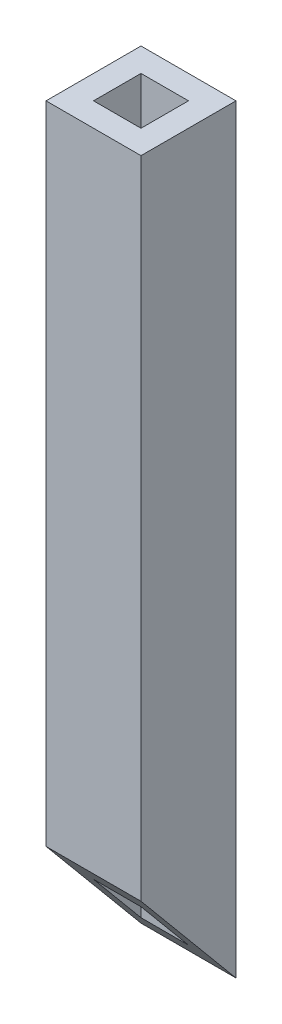
ISO-10303-21;
HEADER;
FILE_DESCRIPTION(('STEP AP214'),'2;1');
FILE_NAME('part.step','',(''),(''),'','','');
FILE_SCHEMA(('AUTOMOTIVE_DESIGN { 1 0 10303 214 1 1 1 1 }'));
ENDSEC;
DATA;
#1=APPLICATION_CONTEXT('core data for automotive mechanical design processes');
#2=APPLICATION_PROTOCOL_DEFINITION('international standard','automotive_design',2000,#1);
#3=PRODUCT_CONTEXT('',#1,'mechanical');
#4=PRODUCT('Part','Part','',(#3));
#5=PRODUCT_RELATED_PRODUCT_CATEGORY('part','',(#4));
#6=PRODUCT_DEFINITION_FORMATION('','',#4);
#7=PRODUCT_DEFINITION_CONTEXT('part definition',#1,'design');
#8=PRODUCT_DEFINITION('design','',#6,#7);
#9=PRODUCT_DEFINITION_SHAPE('','',#8);
#10=(LENGTH_UNIT() NAMED_UNIT(*) SI_UNIT(.MILLI.,.METRE.));
#11=(NAMED_UNIT(*) PLANE_ANGLE_UNIT() SI_UNIT($,.RADIAN.));
#12=(NAMED_UNIT(*) SI_UNIT($,.STERADIAN.) SOLID_ANGLE_UNIT());
#13=UNCERTAINTY_MEASURE_WITH_UNIT(LENGTH_MEASURE(1.E-05),#10,'distance_accuracy_value','');
#14=(GEOMETRIC_REPRESENTATION_CONTEXT(3) GLOBAL_UNCERTAINTY_ASSIGNED_CONTEXT((#13)) GLOBAL_UNIT_ASSIGNED_CONTEXT((#10,
#11,#12)) REPRESENTATION_CONTEXT('',''));
#15=CARTESIAN_POINT('',(0.,0.,0.));
#16=DIRECTION('',(0.,0.,1.));
#17=DIRECTION('',(1.,0.,0.));
#18=AXIS2_PLACEMENT_3D('',#15,#16,#17);
#19=CARTESIAN_POINT('',(0.,0.,25.4));
#20=DIRECTION('',(1.,0.,0.));
#21=DIRECTION('',(0.,0.,-1.));
#22=AXIS2_PLACEMENT_3D('',#19,#20,#21);
#23=PLANE('',#22);
#24=DIRECTION('',(0.,-1.,0.));
#25=VECTOR('',#24,1.);
#26=CARTESIAN_POINT('',(0.,0.,0.));
#27=LINE('',#26,#25);
#28=CARTESIAN_POINT('',(0.,203.2,0.));
#29=VERTEX_POINT('',#28);
#30=CARTESIAN_POINT('',(0.,0.,0.));
#31=VERTEX_POINT('',#30);
#32=EDGE_CURVE('E121',#29,#31,#27,.T.);
#33=ORIENTED_EDGE('',*,*,#32,.T.);
#34=DIRECTION('',(0.,0.768221279597376,0.64018439966448));
#35=VECTOR('',#34,1.);
#36=CARTESIAN_POINT('',(0.,0.,0.));
#37=LINE('',#36,#35);
#38=CARTESIAN_POINT('',(0.,30.48,25.4));
#39=VERTEX_POINT('',#38);
#40=EDGE_CURVE('E106',#31,#39,#37,.T.);
#41=ORIENTED_EDGE('',*,*,#40,.T.);
#42=DIRECTION('',(0.,-1.,0.));
#43=VECTOR('',#42,1.);
#44=CARTESIAN_POINT('',(0.,0.,25.4));
#45=LINE('',#44,#43);
#46=CARTESIAN_POINT('',(0.,203.2,25.4));
#47=VERTEX_POINT('',#46);
#48=EDGE_CURVE('E119',#47,#39,#45,.T.);
#49=ORIENTED_EDGE('',*,*,#48,.F.);
#50=DIRECTION('',(0.,0.,-1.));
#51=VECTOR('',#50,1.);
#52=CARTESIAN_POINT('',(0.,203.2,25.4));
#53=LINE('',#52,#51);
#54=EDGE_CURVE('E143',#47,#29,#53,.T.);
#55=ORIENTED_EDGE('',*,*,#54,.T.);
#56=EDGE_LOOP('',(#33,#41,#49,#55));
#57=FACE_BOUND('',#56,.T.);
#58=ADVANCED_FACE('F39',(#57),#23,.F.);
#59=CARTESIAN_POINT('',(25.4,0.,25.4));
#60=DIRECTION('',(-1.,0.,0.));
#61=DIRECTION('',(0.,0.,1.));
#62=AXIS2_PLACEMENT_3D('',#59,#60,#61);
#63=PLANE('',#62);
#64=DIRECTION('',(0.,1.,0.));
#65=VECTOR('',#64,1.);
#66=CARTESIAN_POINT('',(25.4,0.,25.4));
#67=LINE('',#66,#65);
#68=CARTESIAN_POINT('',(25.4,30.48,25.4));
#69=VERTEX_POINT('',#68);
#70=CARTESIAN_POINT('',(25.4,203.2,25.4));
#71=VERTEX_POINT('',#70);
#72=EDGE_CURVE('E129',#69,#71,#67,.T.);
#73=ORIENTED_EDGE('',*,*,#72,.F.);
#74=DIRECTION('',(0.,0.768221279597376,0.64018439966448));
#75=VECTOR('',#74,1.);
#76=CARTESIAN_POINT('',(25.4,0.,0.));
#77=LINE('',#76,#75);
#78=CARTESIAN_POINT('',(25.4,0.,0.));
#79=VERTEX_POINT('',#78);
#80=EDGE_CURVE('E109',#79,#69,#77,.T.);
#81=ORIENTED_EDGE('',*,*,#80,.F.);
#82=DIRECTION('',(0.,1.,0.));
#83=VECTOR('',#82,1.);
#84=CARTESIAN_POINT('',(25.4,0.,0.));
#85=LINE('',#84,#83);
#86=CARTESIAN_POINT('',(25.4,203.2,0.));
#87=VERTEX_POINT('',#86);
#88=EDGE_CURVE('E135',#79,#87,#85,.T.);
#89=ORIENTED_EDGE('',*,*,#88,.T.);
#90=DIRECTION('',(0.,0.,-1.));
#91=VECTOR('',#90,1.);
#92=CARTESIAN_POINT('',(25.4,203.2,25.4));
#93=LINE('',#92,#91);
#94=EDGE_CURVE('E47',#71,#87,#93,.T.);
#95=ORIENTED_EDGE('',*,*,#94,.F.);
#96=EDGE_LOOP('',(#73,#81,#89,#95));
#97=FACE_BOUND('',#96,.T.);
#98=ADVANCED_FACE('F163',(#97),#63,.F.);
#99=CARTESIAN_POINT('',(0.,203.2,25.4));
#100=DIRECTION('',(0.,-1.,0.));
#101=DIRECTION('',(0.,0.,-1.));
#102=AXIS2_PLACEMENT_3D('',#99,#100,#101);
#103=PLANE('',#102);
#104=DIRECTION('',(1.,0.,0.));
#105=VECTOR('',#104,1.);
#106=CARTESIAN_POINT('',(19.05,203.2,6.35));
#107=LINE('',#106,#105);
#108=CARTESIAN_POINT('',(6.34999999999997,203.2,6.35));
#109=VERTEX_POINT('',#108);
#110=CARTESIAN_POINT('',(19.05,203.2,6.35));
#111=VERTEX_POINT('',#110);
#112=EDGE_CURVE('E187',#109,#111,#107,.T.);
#113=ORIENTED_EDGE('',*,*,#112,.T.);
#114=DIRECTION('',(0.,0.,1.));
#115=VECTOR('',#114,1.);
#116=CARTESIAN_POINT('',(19.05,203.2,6.35));
#117=LINE('',#116,#115);
#118=CARTESIAN_POINT('',(19.05,203.2,19.05));
#119=VERTEX_POINT('',#118);
#120=EDGE_CURVE('E177',#111,#119,#117,.T.);
#121=ORIENTED_EDGE('',*,*,#120,.T.);
#122=DIRECTION('',(-1.,0.,0.));
#123=VECTOR('',#122,1.);
#124=CARTESIAN_POINT('',(19.05,203.2,19.05));
#125=LINE('',#124,#123);
#126=CARTESIAN_POINT('',(6.34999999999997,203.2,19.05));
#127=VERTEX_POINT('',#126);
#128=EDGE_CURVE('E181',#119,#127,#125,.T.);
#129=ORIENTED_EDGE('',*,*,#128,.T.);
#130=DIRECTION('',(0.,0.,-1.));
#131=VECTOR('',#130,1.);
#132=CARTESIAN_POINT('',(6.34999999999997,203.2,6.35));
#133=LINE('',#132,#131);
#134=EDGE_CURVE('E61',#127,#109,#133,.T.);
#135=ORIENTED_EDGE('',*,*,#134,.T.);
#136=EDGE_LOOP('',(#113,#121,#129,#135));
#137=FACE_BOUND('',#136,.T.);
#138=DIRECTION('',(-1.,0.,0.));
#139=VECTOR('',#138,1.);
#140=CARTESIAN_POINT('',(0.,203.2,0.));
#141=LINE('',#140,#139);
#142=EDGE_CURVE('E130',#87,#29,#141,.T.);
#143=ORIENTED_EDGE('',*,*,#142,.T.);
#144=ORIENTED_EDGE('',*,*,#54,.F.);
#145=DIRECTION('',(-1.,0.,0.));
#146=VECTOR('',#145,1.);
#147=CARTESIAN_POINT('',(0.,203.2,25.4));
#148=LINE('',#147,#146);
#149=EDGE_CURVE('E126',#71,#47,#148,.T.);
#150=ORIENTED_EDGE('',*,*,#149,.F.);
#151=ORIENTED_EDGE('',*,*,#94,.T.);
#152=EDGE_LOOP('',(#143,#144,#150,#151));
#153=FACE_BOUND('',#152,.T.);
#154=ADVANCED_FACE('F158',(#137,#153),#103,.F.);
#155=CARTESIAN_POINT('',(0.,0.,25.4));
#156=DIRECTION('',(0.,0.,-1.));
#157=DIRECTION('',(-1.,0.,0.));
#158=AXIS2_PLACEMENT_3D('',#155,#156,#157);
#159=PLANE('',#158);
#160=ORIENTED_EDGE('',*,*,#48,.T.);
#161=DIRECTION('',(1.,0.,0.));
#162=VECTOR('',#161,1.);
#163=CARTESIAN_POINT('',(0.,30.48,25.4));
#164=LINE('',#163,#162);
#165=EDGE_CURVE('E103',#39,#69,#164,.T.);
#166=ORIENTED_EDGE('',*,*,#165,.T.);
#167=ORIENTED_EDGE('',*,*,#72,.T.);
#168=ORIENTED_EDGE('',*,*,#149,.T.);
#169=EDGE_LOOP('',(#160,#166,#167,#168));
#170=FACE_BOUND('',#169,.T.);
#171=ADVANCED_FACE('F124',(#170),#159,.F.);
#172=CARTESIAN_POINT('',(0.,0.,0.));
#173=DIRECTION('',(0.,0.,-1.));
#174=DIRECTION('',(-1.,0.,0.));
#175=AXIS2_PLACEMENT_3D('',#172,#173,#174);
#176=PLANE('',#175);
#177=ORIENTED_EDGE('',*,*,#32,.F.);
#178=ORIENTED_EDGE('',*,*,#142,.F.);
#179=ORIENTED_EDGE('',*,*,#88,.F.);
#180=DIRECTION('',(1.,0.,0.));
#181=VECTOR('',#180,1.);
#182=CARTESIAN_POINT('',(0.,0.,0.));
#183=LINE('',#182,#181);
#184=EDGE_CURVE('E146',#31,#79,#183,.T.);
#185=ORIENTED_EDGE('',*,*,#184,.F.);
#186=EDGE_LOOP('',(#177,#178,#179,#185));
#187=FACE_BOUND('',#186,.T.);
#188=ADVANCED_FACE('F162',(#187),#176,.T.);
#189=CARTESIAN_POINT('',(19.05,203.2,6.35));
#190=DIRECTION('',(1.,0.,0.));
#191=DIRECTION('',(0.,1.,0.));
#192=AXIS2_PLACEMENT_3D('',#189,#190,#191);
#193=PLANE('',#192);
#194=DIRECTION('',(0.,-1.,0.));
#195=VECTOR('',#194,1.);
#196=CARTESIAN_POINT('',(19.05,203.2,6.35));
#197=LINE('',#196,#195);
#198=CARTESIAN_POINT('',(19.05,7.62000000000002,6.35));
#199=VERTEX_POINT('',#198);
#200=EDGE_CURVE('E147',#111,#199,#197,.T.);
#201=ORIENTED_EDGE('',*,*,#200,.T.);
#202=DIRECTION('',(0.,0.768221279597376,0.64018439966448));
#203=VECTOR('',#202,1.);
#204=CARTESIAN_POINT('',(19.05,123.044262295082,102.536885245902));
#205=LINE('',#204,#203);
#206=CARTESIAN_POINT('',(19.05,22.86,19.05));
#207=VERTEX_POINT('',#206);
#208=EDGE_CURVE('E173',#199,#207,#205,.T.);
#209=ORIENTED_EDGE('',*,*,#208,.T.);
#210=DIRECTION('',(0.,-1.,0.));
#211=VECTOR('',#210,1.);
#212=CARTESIAN_POINT('',(19.05,203.2,19.05));
#213=LINE('',#212,#211);
#214=EDGE_CURVE('E138',#119,#207,#213,.T.);
#215=ORIENTED_EDGE('',*,*,#214,.F.);
#216=ORIENTED_EDGE('',*,*,#120,.F.);
#217=EDGE_LOOP('',(#201,#209,#215,#216));
#218=FACE_BOUND('',#217,.T.);
#219=ADVANCED_FACE('F206',(#218),#193,.F.);
#220=CARTESIAN_POINT('',(19.05,203.2,6.35));
#221=DIRECTION('',(0.,0.,-1.));
#222=DIRECTION('',(-1.,0.,0.));
#223=AXIS2_PLACEMENT_3D('',#220,#221,#222);
#224=PLANE('',#223);
#225=DIRECTION('',(0.,-1.,0.));
#226=VECTOR('',#225,1.);
#227=CARTESIAN_POINT('',(6.34999999999997,203.2,6.35));
#228=LINE('',#227,#226);
#229=CARTESIAN_POINT('',(6.35,7.62,6.34999999999998));
#230=VERTEX_POINT('',#229);
#231=EDGE_CURVE('E194',#109,#230,#228,.T.);
#232=ORIENTED_EDGE('',*,*,#231,.T.);
#233=DIRECTION('',(1.,0.,0.));
#234=VECTOR('',#233,1.);
#235=CARTESIAN_POINT('',(19.05,7.62000000000002,6.35));
#236=LINE('',#235,#234);
#237=EDGE_CURVE('E169',#230,#199,#236,.T.);
#238=ORIENTED_EDGE('',*,*,#237,.T.);
#239=ORIENTED_EDGE('',*,*,#200,.F.);
#240=ORIENTED_EDGE('',*,*,#112,.F.);
#241=EDGE_LOOP('',(#232,#238,#239,#240));
#242=FACE_BOUND('',#241,.T.);
#243=ADVANCED_FACE('F208',(#242),#224,.F.);
#244=CARTESIAN_POINT('',(6.34999999999997,203.2,6.35));
#245=DIRECTION('',(-1.,0.,0.));
#246=DIRECTION('',(0.,-1.,0.));
#247=AXIS2_PLACEMENT_3D('',#244,#245,#246);
#248=PLANE('',#247);
#249=DIRECTION('',(0.,-1.,0.));
#250=VECTOR('',#249,1.);
#251=CARTESIAN_POINT('',(6.34999999999997,203.2,19.05));
#252=LINE('',#251,#250);
#253=CARTESIAN_POINT('',(6.35,22.86,19.05));
#254=VERTEX_POINT('',#253);
#255=EDGE_CURVE('E197',#127,#254,#252,.T.);
#256=ORIENTED_EDGE('',*,*,#255,.T.);
#257=DIRECTION('',(0.,-0.768221279597376,-0.64018439966448));
#258=VECTOR('',#257,1.);
#259=CARTESIAN_POINT('',(6.34999999999998,123.044262295082,102.536885245902));
#260=LINE('',#259,#258);
#261=EDGE_CURVE('E54',#254,#230,#260,.T.);
#262=ORIENTED_EDGE('',*,*,#261,.T.);
#263=ORIENTED_EDGE('',*,*,#231,.F.);
#264=ORIENTED_EDGE('',*,*,#134,.F.);
#265=EDGE_LOOP('',(#256,#262,#263,#264));
#266=FACE_BOUND('',#265,.T.);
#267=ADVANCED_FACE('F210',(#266),#248,.F.);
#268=CARTESIAN_POINT('',(19.05,203.2,19.05));
#269=DIRECTION('',(0.,0.,1.));
#270=DIRECTION('',(1.,0.,0.));
#271=AXIS2_PLACEMENT_3D('',#268,#269,#270);
#272=PLANE('',#271);
#273=ORIENTED_EDGE('',*,*,#214,.T.);
#274=DIRECTION('',(-1.,0.,0.));
#275=VECTOR('',#274,1.);
#276=CARTESIAN_POINT('',(19.05,22.86,19.05));
#277=LINE('',#276,#275);
#278=EDGE_CURVE('E11',#207,#254,#277,.T.);
#279=ORIENTED_EDGE('',*,*,#278,.T.);
#280=ORIENTED_EDGE('',*,*,#255,.F.);
#281=ORIENTED_EDGE('',*,*,#128,.F.);
#282=EDGE_LOOP('',(#273,#279,#280,#281));
#283=FACE_BOUND('',#282,.T.);
#284=ADVANCED_FACE('F203',(#283),#272,.F.);
#285=CARTESIAN_POINT('',(0.,0.,0.));
#286=DIRECTION('',(0.,0.64018439966448,-0.768221279597376));
#287=DIRECTION('',(0.,0.768221279597376,0.64018439966448));
#288=AXIS2_PLACEMENT_3D('',#285,#286,#287);
#289=PLANE('',#288);
#290=ORIENTED_EDGE('',*,*,#80,.T.);
#291=ORIENTED_EDGE('',*,*,#165,.F.);
#292=ORIENTED_EDGE('',*,*,#40,.F.);
#293=ORIENTED_EDGE('',*,*,#184,.T.);
#294=EDGE_LOOP('',(#290,#291,#292,#293));
#295=FACE_BOUND('',#294,.T.);
#296=ORIENTED_EDGE('',*,*,#237,.F.);
#297=ORIENTED_EDGE('',*,*,#261,.F.);
#298=ORIENTED_EDGE('',*,*,#278,.F.);
#299=ORIENTED_EDGE('',*,*,#208,.F.);
#300=EDGE_LOOP('',(#296,#297,#298,#299));
#301=FACE_BOUND('',#300,.T.);
#302=ADVANCED_FACE('F105',(#295,#301),#289,.F.);
#303=CLOSED_SHELL('',(#58,#98,#154,#171,#188,#219,#243,#267,#284,#302));
#304=MANIFOLD_SOLID_BREP('B2',#303);
#305=ADVANCED_BREP_SHAPE_REPRESENTATION('',(#18,#304),#14);
#306=SHAPE_DEFINITION_REPRESENTATION(#9,#305);
ENDSEC;
END-ISO-10303-21;
